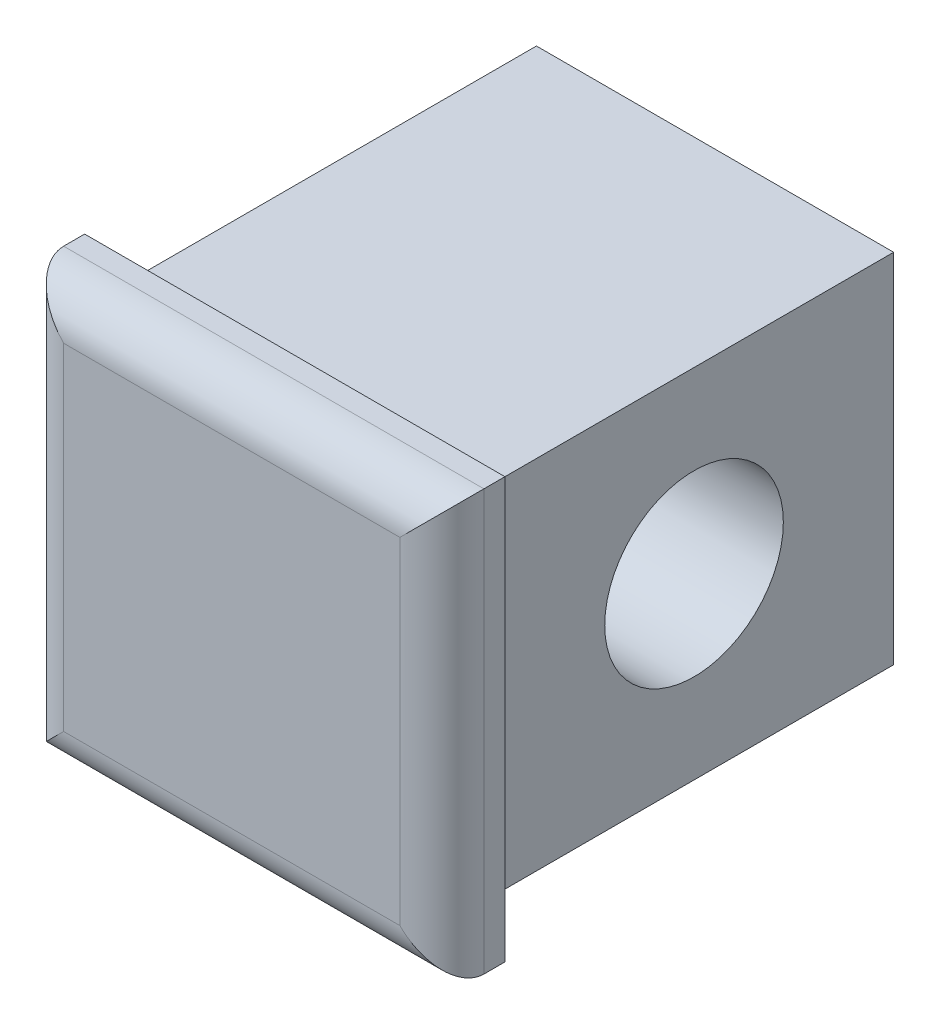
ISO-10303-21;
HEADER;
FILE_DESCRIPTION(('STEP AP214'),'2;1');
FILE_NAME('part.step','',(''),(''),'','','');
FILE_SCHEMA(('AUTOMOTIVE_DESIGN { 1 0 10303 214 1 1 1 1 }'));
ENDSEC;
DATA;
#1=APPLICATION_CONTEXT('core data for automotive mechanical design processes');
#2=APPLICATION_PROTOCOL_DEFINITION('international standard','automotive_design',2000,#1);
#3=PRODUCT_CONTEXT('',#1,'mechanical');
#4=PRODUCT('Part','Part','',(#3));
#5=PRODUCT_RELATED_PRODUCT_CATEGORY('part','',(#4));
#6=PRODUCT_DEFINITION_FORMATION('','',#4);
#7=PRODUCT_DEFINITION_CONTEXT('part definition',#1,'design');
#8=PRODUCT_DEFINITION('design','',#6,#7);
#9=PRODUCT_DEFINITION_SHAPE('','',#8);
#10=(LENGTH_UNIT() NAMED_UNIT(*) SI_UNIT(.MILLI.,.METRE.));
#11=(NAMED_UNIT(*) PLANE_ANGLE_UNIT() SI_UNIT($,.RADIAN.));
#12=(NAMED_UNIT(*) SI_UNIT($,.STERADIAN.) SOLID_ANGLE_UNIT());
#13=UNCERTAINTY_MEASURE_WITH_UNIT(LENGTH_MEASURE(1.E-05),#10,'distance_accuracy_value','');
#14=(GEOMETRIC_REPRESENTATION_CONTEXT(3) GLOBAL_UNCERTAINTY_ASSIGNED_CONTEXT((#13)) GLOBAL_UNIT_ASSIGNED_CONTEXT((#10,
#11,#12)) REPRESENTATION_CONTEXT('',''));
#15=CARTESIAN_POINT('',(0.,0.,0.));
#16=DIRECTION('',(0.,0.,1.));
#17=DIRECTION('',(1.,0.,0.));
#18=AXIS2_PLACEMENT_3D('',#15,#16,#17);
#19=CARTESIAN_POINT('',(10.,10.,0.));
#20=DIRECTION('',(0.,0.,1.));
#21=DIRECTION('',(0.,-1.,0.));
#22=AXIS2_PLACEMENT_3D('',#19,#20,#21);
#23=PLANE('',#22);
#24=DIRECTION('',(0.,1.,0.));
#25=VECTOR('',#24,1.);
#26=CARTESIAN_POINT('',(-10.,10.,0.));
#27=LINE('',#26,#25);
#28=CARTESIAN_POINT('',(-10.,-10.,0.));
#29=VERTEX_POINT('',#28);
#30=CARTESIAN_POINT('',(-10.,10.,0.));
#31=VERTEX_POINT('',#30);
#32=EDGE_CURVE('E152',#29,#31,#27,.T.);
#33=ORIENTED_EDGE('',*,*,#32,.T.);
#34=DIRECTION('',(-1.,0.,0.));
#35=VECTOR('',#34,1.);
#36=CARTESIAN_POINT('',(10.,10.,0.));
#37=LINE('',#36,#35);
#38=CARTESIAN_POINT('',(10.,10.,0.));
#39=VERTEX_POINT('',#38);
#40=EDGE_CURVE('E155',#39,#31,#37,.T.);
#41=ORIENTED_EDGE('',*,*,#40,.F.);
#42=DIRECTION('',(0.,1.,0.));
#43=VECTOR('',#42,1.);
#44=CARTESIAN_POINT('',(10.,10.,0.));
#45=LINE('',#44,#43);
#46=CARTESIAN_POINT('',(10.,-10.,0.));
#47=VERTEX_POINT('',#46);
#48=EDGE_CURVE('E154',#47,#39,#45,.T.);
#49=ORIENTED_EDGE('',*,*,#48,.F.);
#50=DIRECTION('',(-1.,0.,0.));
#51=VECTOR('',#50,1.);
#52=CARTESIAN_POINT('',(10.,-10.,0.));
#53=LINE('',#52,#51);
#54=EDGE_CURVE('E161',#47,#29,#53,.T.);
#55=ORIENTED_EDGE('',*,*,#54,.T.);
#56=EDGE_LOOP('',(#33,#41,#49,#55));
#57=FACE_BOUND('',#56,.T.);
#58=DIRECTION('',(0.,1.,0.));
#59=VECTOR('',#58,1.);
#60=CARTESIAN_POINT('',(-8.5,-8.5,0.));
#61=LINE('',#60,#59);
#62=CARTESIAN_POINT('',(-8.5,-8.5,0.));
#63=VERTEX_POINT('',#62);
#64=CARTESIAN_POINT('',(-8.5,8.5,0.));
#65=VERTEX_POINT('',#64);
#66=EDGE_CURVE('E139',#63,#65,#61,.T.);
#67=ORIENTED_EDGE('',*,*,#66,.F.);
#68=DIRECTION('',(-1.,0.,0.));
#69=VECTOR('',#68,1.);
#70=CARTESIAN_POINT('',(8.5,-8.5,0.));
#71=LINE('',#70,#69);
#72=CARTESIAN_POINT('',(8.5,-8.5,0.));
#73=VERTEX_POINT('',#72);
#74=EDGE_CURVE('E136',#73,#63,#71,.T.);
#75=ORIENTED_EDGE('',*,*,#74,.F.);
#76=DIRECTION('',(0.,-1.,0.));
#77=VECTOR('',#76,1.);
#78=CARTESIAN_POINT('',(8.5,-8.5,0.));
#79=LINE('',#78,#77);
#80=CARTESIAN_POINT('',(8.5,8.5,0.));
#81=VERTEX_POINT('',#80);
#82=EDGE_CURVE('E206',#81,#73,#79,.T.);
#83=ORIENTED_EDGE('',*,*,#82,.F.);
#84=DIRECTION('',(1.,0.,0.));
#85=VECTOR('',#84,1.);
#86=CARTESIAN_POINT('',(8.5,8.5,0.));
#87=LINE('',#86,#85);
#88=EDGE_CURVE('E204',#65,#81,#87,.T.);
#89=ORIENTED_EDGE('',*,*,#88,.F.);
#90=EDGE_LOOP('',(#67,#75,#83,#89));
#91=FACE_BOUND('',#90,.T.);
#92=ADVANCED_FACE('F37',(#57,#91),#23,.F.);
#93=CARTESIAN_POINT('',(10.,10.,0.));
#94=DIRECTION('',(0.,-1.,0.));
#95=DIRECTION('',(0.,0.,-1.));
#96=AXIS2_PLACEMENT_3D('',#93,#94,#95);
#97=PLANE('',#96);
#98=DIRECTION('',(0.,0.,1.));
#99=VECTOR('',#98,1.);
#100=CARTESIAN_POINT('',(-10.,10.,0.));
#101=LINE('',#100,#99);
#102=CARTESIAN_POINT('',(-10.,10.,1.));
#103=VERTEX_POINT('',#102);
#104=EDGE_CURVE('E140',#31,#103,#101,.T.);
#105=ORIENTED_EDGE('',*,*,#104,.T.);
#106=DIRECTION('',(-1.,0.,0.));
#107=VECTOR('',#106,1.);
#108=CARTESIAN_POINT('',(10.,10.,1.));
#109=LINE('',#108,#107);
#110=CARTESIAN_POINT('',(10.,10.,1.));
#111=VERTEX_POINT('',#110);
#112=EDGE_CURVE('E173',#103,#111,#109,.F.);
#113=ORIENTED_EDGE('',*,*,#112,.T.);
#114=DIRECTION('',(0.,0.,1.));
#115=VECTOR('',#114,1.);
#116=CARTESIAN_POINT('',(10.,10.,0.));
#117=LINE('',#116,#115);
#118=EDGE_CURVE('E149',#39,#111,#117,.T.);
#119=ORIENTED_EDGE('',*,*,#118,.F.);
#120=ORIENTED_EDGE('',*,*,#40,.T.);
#121=EDGE_LOOP('',(#105,#113,#119,#120));
#122=FACE_BOUND('',#121,.T.);
#123=ADVANCED_FACE('F219',(#122),#97,.F.);
#124=CARTESIAN_POINT('',(10.,10.,3.));
#125=DIRECTION('',(0.,0.,-1.));
#126=DIRECTION('',(-1.,0.,0.));
#127=AXIS2_PLACEMENT_3D('',#124,#125,#126);
#128=PLANE('',#127);
#129=DIRECTION('',(0.,-1.,0.));
#130=VECTOR('',#129,1.);
#131=CARTESIAN_POINT('',(8.,10.,3.));
#132=LINE('',#131,#130);
#133=CARTESIAN_POINT('',(8.,-8.,3.));
#134=VERTEX_POINT('',#133);
#135=CARTESIAN_POINT('',(8.,8.,3.));
#136=VERTEX_POINT('',#135);
#137=EDGE_CURVE('E168',#134,#136,#132,.F.);
#138=ORIENTED_EDGE('',*,*,#137,.T.);
#139=DIRECTION('',(-1.,0.,0.));
#140=VECTOR('',#139,1.);
#141=CARTESIAN_POINT('',(10.,8.,3.));
#142=LINE('',#141,#140);
#143=CARTESIAN_POINT('',(-8.,8.,3.));
#144=VERTEX_POINT('',#143);
#145=EDGE_CURVE('E170',#136,#144,#142,.T.);
#146=ORIENTED_EDGE('',*,*,#145,.T.);
#147=DIRECTION('',(0.,-1.,0.));
#148=VECTOR('',#147,1.);
#149=CARTESIAN_POINT('',(-8.,10.,3.));
#150=LINE('',#149,#148);
#151=CARTESIAN_POINT('',(-8.,-8.,3.));
#152=VERTEX_POINT('',#151);
#153=EDGE_CURVE('E164',#144,#152,#150,.T.);
#154=ORIENTED_EDGE('',*,*,#153,.T.);
#155=DIRECTION('',(-1.,0.,0.));
#156=VECTOR('',#155,1.);
#157=CARTESIAN_POINT('',(10.,-8.,3.));
#158=LINE('',#157,#156);
#159=EDGE_CURVE('E166',#152,#134,#158,.F.);
#160=ORIENTED_EDGE('',*,*,#159,.T.);
#161=EDGE_LOOP('',(#138,#146,#154,#160));
#162=FACE_BOUND('',#161,.T.);
#163=ADVANCED_FACE('F225',(#162),#128,.F.);
#164=CARTESIAN_POINT('',(10.,-10.,3.));
#165=DIRECTION('',(0.,1.,0.));
#166=DIRECTION('',(0.,0.,1.));
#167=AXIS2_PLACEMENT_3D('',#164,#165,#166);
#168=PLANE('',#167);
#169=DIRECTION('',(0.,0.,-1.));
#170=VECTOR('',#169,1.);
#171=CARTESIAN_POINT('',(10.,-10.,3.));
#172=LINE('',#171,#170);
#173=CARTESIAN_POINT('',(10.,-10.,1.));
#174=VERTEX_POINT('',#173);
#175=EDGE_CURVE('E151',#174,#47,#172,.T.);
#176=ORIENTED_EDGE('',*,*,#175,.F.);
#177=DIRECTION('',(-1.,0.,0.));
#178=VECTOR('',#177,1.);
#179=CARTESIAN_POINT('',(10.,-10.,1.));
#180=LINE('',#179,#178);
#181=CARTESIAN_POINT('',(-10.,-10.,1.));
#182=VERTEX_POINT('',#181);
#183=EDGE_CURVE('E46',#174,#182,#180,.T.);
#184=ORIENTED_EDGE('',*,*,#183,.T.);
#185=DIRECTION('',(0.,0.,-1.));
#186=VECTOR('',#185,1.);
#187=CARTESIAN_POINT('',(-10.,-10.,3.));
#188=LINE('',#187,#186);
#189=EDGE_CURVE('E143',#182,#29,#188,.T.);
#190=ORIENTED_EDGE('',*,*,#189,.T.);
#191=ORIENTED_EDGE('',*,*,#54,.F.);
#192=EDGE_LOOP('',(#176,#184,#190,#191));
#193=FACE_BOUND('',#192,.T.);
#194=ADVANCED_FACE('F232',(#193),#168,.F.);
#195=CARTESIAN_POINT('',(10.,0.,0.));
#196=DIRECTION('',(1.,0.,0.));
#197=DIRECTION('',(0.,0.,-1.));
#198=AXIS2_PLACEMENT_3D('',#195,#196,#197);
#199=PLANE('',#198);
#200=ORIENTED_EDGE('',*,*,#118,.T.);
#201=DIRECTION('',(0.,-1.,0.));
#202=VECTOR('',#201,1.);
#203=CARTESIAN_POINT('',(10.,-10.,1.));
#204=LINE('',#203,#202);
#205=EDGE_CURVE('E61',#111,#174,#204,.T.);
#206=ORIENTED_EDGE('',*,*,#205,.T.);
#207=ORIENTED_EDGE('',*,*,#175,.T.);
#208=ORIENTED_EDGE('',*,*,#48,.T.);
#209=EDGE_LOOP('',(#200,#206,#207,#208));
#210=FACE_BOUND('',#209,.T.);
#211=ADVANCED_FACE('F235',(#210),#199,.T.);
#212=CARTESIAN_POINT('',(-10.,0.,0.));
#213=DIRECTION('',(1.,0.,0.));
#214=DIRECTION('',(0.,0.,-1.));
#215=AXIS2_PLACEMENT_3D('',#212,#213,#214);
#216=PLANE('',#215);
#217=ORIENTED_EDGE('',*,*,#189,.F.);
#218=DIRECTION('',(0.,-1.,0.));
#219=VECTOR('',#218,1.);
#220=CARTESIAN_POINT('',(-10.,0.,1.));
#221=LINE('',#220,#219);
#222=EDGE_CURVE('E11',#182,#103,#221,.F.);
#223=ORIENTED_EDGE('',*,*,#222,.T.);
#224=ORIENTED_EDGE('',*,*,#104,.F.);
#225=ORIENTED_EDGE('',*,*,#32,.F.);
#226=EDGE_LOOP('',(#217,#223,#224,#225));
#227=FACE_BOUND('',#226,.T.);
#228=ADVANCED_FACE('F230',(#227),#216,.F.);
#229=CARTESIAN_POINT('',(-8.5,-8.5,-20.));
#230=DIRECTION('',(1.,0.,0.));
#231=DIRECTION('',(0.,0.,-1.));
#232=AXIS2_PLACEMENT_3D('',#229,#230,#231);
#233=PLANE('',#232);
#234=CARTESIAN_POINT('',(-8.5,0.,-10.5));
#235=DIRECTION('',(1.,0.,0.));
#236=DIRECTION('',(0.,0.,-1.));
#237=AXIS2_PLACEMENT_3D('',#234,#235,#236);
#238=CIRCLE('',#237,4.25);
#239=CARTESIAN_POINT('',(-8.5,0.,-14.75));
#240=VERTEX_POINT('',#239);
#241=EDGE_CURVE('E193',#240,#240,#238,.T.);
#242=ORIENTED_EDGE('',*,*,#241,.T.);
#243=EDGE_LOOP('',(#242));
#244=FACE_BOUND('',#243,.T.);
#245=ORIENTED_EDGE('',*,*,#66,.T.);
#246=DIRECTION('',(0.,0.,1.));
#247=VECTOR('',#246,1.);
#248=CARTESIAN_POINT('',(-8.5,8.5,-20.));
#249=LINE('',#248,#247);
#250=CARTESIAN_POINT('',(-8.5,8.5,-20.));
#251=VERTEX_POINT('',#250);
#252=EDGE_CURVE('E120',#251,#65,#249,.T.);
#253=ORIENTED_EDGE('',*,*,#252,.F.);
#254=DIRECTION('',(0.,1.,0.));
#255=VECTOR('',#254,1.);
#256=CARTESIAN_POINT('',(-8.5,-8.5,-20.));
#257=LINE('',#256,#255);
#258=CARTESIAN_POINT('',(-8.5,-8.5,-20.));
#259=VERTEX_POINT('',#258);
#260=EDGE_CURVE('E127',#259,#251,#257,.T.);
#261=ORIENTED_EDGE('',*,*,#260,.F.);
#262=DIRECTION('',(0.,0.,1.));
#263=VECTOR('',#262,1.);
#264=CARTESIAN_POINT('',(-8.5,-8.5,-20.));
#265=LINE('',#264,#263);
#266=EDGE_CURVE('E202',#259,#63,#265,.T.);
#267=ORIENTED_EDGE('',*,*,#266,.T.);
#268=EDGE_LOOP('',(#245,#253,#261,#267));
#269=FACE_BOUND('',#268,.T.);
#270=ADVANCED_FACE('F138',(#244,#269),#233,.F.);
#271=CARTESIAN_POINT('',(8.5,8.5,-20.));
#272=DIRECTION('',(0.,-1.,0.));
#273=DIRECTION('',(0.,0.,-1.));
#274=AXIS2_PLACEMENT_3D('',#271,#272,#273);
#275=PLANE('',#274);
#276=ORIENTED_EDGE('',*,*,#88,.T.);
#277=DIRECTION('',(0.,0.,1.));
#278=VECTOR('',#277,1.);
#279=CARTESIAN_POINT('',(8.5,8.5,-20.));
#280=LINE('',#279,#278);
#281=CARTESIAN_POINT('',(8.5,8.5,-20.));
#282=VERTEX_POINT('',#281);
#283=EDGE_CURVE('E123',#282,#81,#280,.T.);
#284=ORIENTED_EDGE('',*,*,#283,.F.);
#285=DIRECTION('',(1.,0.,0.));
#286=VECTOR('',#285,1.);
#287=CARTESIAN_POINT('',(8.5,8.5,-20.));
#288=LINE('',#287,#286);
#289=EDGE_CURVE('E115',#251,#282,#288,.T.);
#290=ORIENTED_EDGE('',*,*,#289,.F.);
#291=ORIENTED_EDGE('',*,*,#252,.T.);
#292=EDGE_LOOP('',(#276,#284,#290,#291));
#293=FACE_BOUND('',#292,.T.);
#294=ADVANCED_FACE('F118',(#293),#275,.F.);
#295=CARTESIAN_POINT('',(8.5,-8.5,-20.));
#296=DIRECTION('',(-1.,0.,0.));
#297=DIRECTION('',(0.,0.,1.));
#298=AXIS2_PLACEMENT_3D('',#295,#296,#297);
#299=PLANE('',#298);
#300=CARTESIAN_POINT('',(8.5,0.,-10.5));
#301=DIRECTION('',(1.,0.,0.));
#302=DIRECTION('',(0.,0.,-1.));
#303=AXIS2_PLACEMENT_3D('',#300,#301,#302);
#304=CIRCLE('',#303,4.25);
#305=CARTESIAN_POINT('',(8.5,0.,-14.75));
#306=VERTEX_POINT('',#305);
#307=EDGE_CURVE('E188',#306,#306,#304,.T.);
#308=ORIENTED_EDGE('',*,*,#307,.F.);
#309=EDGE_LOOP('',(#308));
#310=FACE_BOUND('',#309,.T.);
#311=ORIENTED_EDGE('',*,*,#82,.T.);
#312=DIRECTION('',(0.,0.,1.));
#313=VECTOR('',#312,1.);
#314=CARTESIAN_POINT('',(8.5,-8.5,-20.));
#315=LINE('',#314,#313);
#316=CARTESIAN_POINT('',(8.5,-8.5,-20.));
#317=VERTEX_POINT('',#316);
#318=EDGE_CURVE('E145',#317,#73,#315,.T.);
#319=ORIENTED_EDGE('',*,*,#318,.F.);
#320=DIRECTION('',(0.,-1.,0.));
#321=VECTOR('',#320,1.);
#322=CARTESIAN_POINT('',(8.5,-8.5,-20.));
#323=LINE('',#322,#321);
#324=EDGE_CURVE('E126',#282,#317,#323,.T.);
#325=ORIENTED_EDGE('',*,*,#324,.F.);
#326=ORIENTED_EDGE('',*,*,#283,.T.);
#327=EDGE_LOOP('',(#311,#319,#325,#326));
#328=FACE_BOUND('',#327,.T.);
#329=ADVANCED_FACE('F216',(#310,#328),#299,.F.);
#330=CARTESIAN_POINT('',(8.5,-8.5,-20.));
#331=DIRECTION('',(0.,1.,0.));
#332=DIRECTION('',(0.,0.,1.));
#333=AXIS2_PLACEMENT_3D('',#330,#331,#332);
#334=PLANE('',#333);
#335=ORIENTED_EDGE('',*,*,#74,.T.);
#336=ORIENTED_EDGE('',*,*,#266,.F.);
#337=DIRECTION('',(-1.,0.,0.));
#338=VECTOR('',#337,1.);
#339=CARTESIAN_POINT('',(8.5,-8.5,-20.));
#340=LINE('',#339,#338);
#341=EDGE_CURVE('E132',#317,#259,#340,.T.);
#342=ORIENTED_EDGE('',*,*,#341,.F.);
#343=ORIENTED_EDGE('',*,*,#318,.T.);
#344=EDGE_LOOP('',(#335,#336,#342,#343));
#345=FACE_BOUND('',#344,.T.);
#346=ADVANCED_FACE('F214',(#345),#334,.F.);
#347=CARTESIAN_POINT('',(0.,0.,-20.));
#348=DIRECTION('',(0.,0.,1.));
#349=DIRECTION('',(1.,0.,0.));
#350=AXIS2_PLACEMENT_3D('',#347,#348,#349);
#351=PLANE('',#350);
#352=ORIENTED_EDGE('',*,*,#260,.T.);
#353=ORIENTED_EDGE('',*,*,#289,.T.);
#354=ORIENTED_EDGE('',*,*,#324,.T.);
#355=ORIENTED_EDGE('',*,*,#341,.T.);
#356=EDGE_LOOP('',(#352,#353,#354,#355));
#357=FACE_BOUND('',#356,.T.);
#358=ADVANCED_FACE('F130',(#357),#351,.F.);
#359=CARTESIAN_POINT('',(-10.,0.,-10.5));
#360=DIRECTION('',(1.,0.,0.));
#361=DIRECTION('',(0.,0.,-1.));
#362=AXIS2_PLACEMENT_3D('',#359,#360,#361);
#363=CYLINDRICAL_SURFACE('',#362,4.25);
#364=ORIENTED_EDGE('',*,*,#307,.T.);
#365=EDGE_LOOP('',(#364));
#366=FACE_BOUND('',#365,.T.);
#367=ORIENTED_EDGE('',*,*,#241,.F.);
#368=EDGE_LOOP('',(#367));
#369=FACE_BOUND('',#368,.T.);
#370=ADVANCED_FACE('F250',(#366,#369),#363,.F.);
#371=CARTESIAN_POINT('',(10.,-8.,1.));
#372=DIRECTION('',(-1.,0.,0.));
#373=DIRECTION('',(0.,0.,1.));
#374=AXIS2_PLACEMENT_3D('',#371,#372,#373);
#375=CYLINDRICAL_SURFACE('',#374,2.);
#376=CARTESIAN_POINT('',(-8.,-8.,1.));
#377=DIRECTION('',(0.707106781186547,-0.707106781186547,0.));
#378=DIRECTION('',(-0.707106781186547,-0.707106781186547,0.));
#379=AXIS2_PLACEMENT_3D('',#376,#377,#378);
#380=ELLIPSE('',#379,2.82842712474619,2.);
#381=EDGE_CURVE('E181',#182,#152,#380,.F.);
#382=ORIENTED_EDGE('',*,*,#381,.F.);
#383=ORIENTED_EDGE('',*,*,#183,.F.);
#384=CARTESIAN_POINT('',(8.,-8.,1.));
#385=DIRECTION('',(-0.707106781186547,-0.707106781186547,0.));
#386=DIRECTION('',(-0.707106781186547,0.707106781186547,0.));
#387=AXIS2_PLACEMENT_3D('',#384,#385,#386);
#388=ELLIPSE('',#387,2.82842712474619,2.);
#389=EDGE_CURVE('E41',#134,#174,#388,.F.);
#390=ORIENTED_EDGE('',*,*,#389,.F.);
#391=ORIENTED_EDGE('',*,*,#159,.F.);
#392=EDGE_LOOP('',(#382,#383,#390,#391));
#393=FACE_BOUND('',#392,.T.);
#394=ADVANCED_FACE('F39',(#393),#375,.T.);
#395=CARTESIAN_POINT('',(8.,0.,1.));
#396=DIRECTION('',(0.,1.,0.));
#397=DIRECTION('',(0.,0.,1.));
#398=AXIS2_PLACEMENT_3D('',#395,#396,#397);
#399=CYLINDRICAL_SURFACE('',#398,2.);
#400=ORIENTED_EDGE('',*,*,#389,.T.);
#401=ORIENTED_EDGE('',*,*,#205,.F.);
#402=CARTESIAN_POINT('',(8.,8.,1.));
#403=DIRECTION('',(-0.707106781186547,0.707106781186547,0.));
#404=DIRECTION('',(0.707106781186547,0.707106781186547,0.));
#405=AXIS2_PLACEMENT_3D('',#402,#403,#404);
#406=ELLIPSE('',#405,2.82842712474619,2.);
#407=EDGE_CURVE('E180',#136,#111,#406,.T.);
#408=ORIENTED_EDGE('',*,*,#407,.F.);
#409=ORIENTED_EDGE('',*,*,#137,.F.);
#410=EDGE_LOOP('',(#400,#401,#408,#409));
#411=FACE_BOUND('',#410,.T.);
#412=ADVANCED_FACE('F245',(#411),#399,.T.);
#413=CARTESIAN_POINT('',(-8.,10.,1.));
#414=DIRECTION('',(0.,-1.,0.));
#415=DIRECTION('',(0.,0.,-1.));
#416=AXIS2_PLACEMENT_3D('',#413,#414,#415);
#417=CYLINDRICAL_SURFACE('',#416,2.);
#418=ORIENTED_EDGE('',*,*,#381,.T.);
#419=ORIENTED_EDGE('',*,*,#153,.F.);
#420=CARTESIAN_POINT('',(-8.,8.,1.));
#421=DIRECTION('',(-0.707106781186547,-0.707106781186547,0.));
#422=DIRECTION('',(0.707106781186547,-0.707106781186547,0.));
#423=AXIS2_PLACEMENT_3D('',#420,#421,#422);
#424=ELLIPSE('',#423,2.82842712474619,2.);
#425=EDGE_CURVE('E178',#103,#144,#424,.F.);
#426=ORIENTED_EDGE('',*,*,#425,.F.);
#427=ORIENTED_EDGE('',*,*,#222,.F.);
#428=EDGE_LOOP('',(#418,#419,#426,#427));
#429=FACE_BOUND('',#428,.T.);
#430=ADVANCED_FACE('F242',(#429),#417,.T.);
#431=CARTESIAN_POINT('',(10.,8.,1.));
#432=DIRECTION('',(-1.,0.,0.));
#433=DIRECTION('',(0.,0.,1.));
#434=AXIS2_PLACEMENT_3D('',#431,#432,#433);
#435=CYLINDRICAL_SURFACE('',#434,2.);
#436=ORIENTED_EDGE('',*,*,#407,.T.);
#437=ORIENTED_EDGE('',*,*,#112,.F.);
#438=ORIENTED_EDGE('',*,*,#425,.T.);
#439=ORIENTED_EDGE('',*,*,#145,.F.);
#440=EDGE_LOOP('',(#436,#437,#438,#439));
#441=FACE_BOUND('',#440,.T.);
#442=ADVANCED_FACE('F239',(#441),#435,.T.);
#443=CLOSED_SHELL('',(#92,#123,#163,#194,#211,#228,#270,#294,#329,#346,#358,#370,#394,#412,#430,#442));
#444=MANIFOLD_SOLID_BREP('B2',#443);
#445=ADVANCED_BREP_SHAPE_REPRESENTATION('',(#18,#444),#14);
#446=SHAPE_DEFINITION_REPRESENTATION(#9,#445);
ENDSEC;
END-ISO-10303-21;
